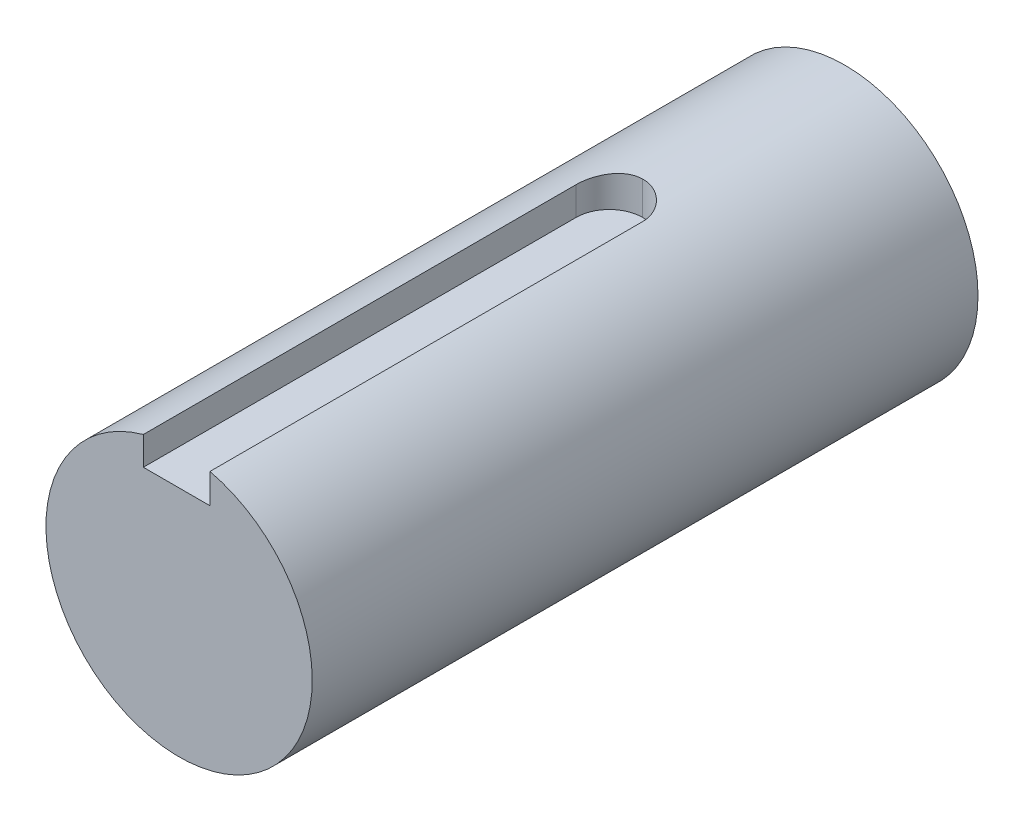
ISO-10303-21;
HEADER;
FILE_DESCRIPTION(('STEP AP214'),'2;1');
FILE_NAME('part.step','',(''),(''),'','','');
FILE_SCHEMA(('AUTOMOTIVE_DESIGN { 1 0 10303 214 1 1 1 1 }'));
ENDSEC;
DATA;
#1=APPLICATION_CONTEXT('core data for automotive mechanical design processes');
#2=APPLICATION_PROTOCOL_DEFINITION('international standard','automotive_design',2000,#1);
#3=PRODUCT_CONTEXT('',#1,'mechanical');
#4=PRODUCT('Part','Part','',(#3));
#5=PRODUCT_RELATED_PRODUCT_CATEGORY('part','',(#4));
#6=PRODUCT_DEFINITION_FORMATION('','',#4);
#7=PRODUCT_DEFINITION_CONTEXT('part definition',#1,'design');
#8=PRODUCT_DEFINITION('design','',#6,#7);
#9=PRODUCT_DEFINITION_SHAPE('','',#8);
#10=(LENGTH_UNIT() NAMED_UNIT(*) SI_UNIT(.MILLI.,.METRE.));
#11=(NAMED_UNIT(*) PLANE_ANGLE_UNIT() SI_UNIT($,.RADIAN.));
#12=(NAMED_UNIT(*) SI_UNIT($,.STERADIAN.) SOLID_ANGLE_UNIT());
#13=UNCERTAINTY_MEASURE_WITH_UNIT(LENGTH_MEASURE(1.E-05),#10,'distance_accuracy_value','');
#14=(GEOMETRIC_REPRESENTATION_CONTEXT(3) GLOBAL_UNCERTAINTY_ASSIGNED_CONTEXT((#13)) GLOBAL_UNIT_ASSIGNED_CONTEXT((#10,
#11,#12)) REPRESENTATION_CONTEXT('',''));
#15=CARTESIAN_POINT('',(0.,0.,0.));
#16=DIRECTION('',(0.,0.,1.));
#17=DIRECTION('',(1.,0.,0.));
#18=AXIS2_PLACEMENT_3D('',#15,#16,#17);
#19=CARTESIAN_POINT('',(0.,0.,250.));
#20=DIRECTION('',(0.,0.,-1.));
#21=DIRECTION('',(-1.,0.,0.));
#22=AXIS2_PLACEMENT_3D('',#19,#20,#21);
#23=CYLINDRICAL_SURFACE('',#22,50.);
#24=DIRECTION('',(0.,0.,-1.));
#25=VECTOR('',#24,1.);
#26=CARTESIAN_POINT('',(-13.4196866947124,48.1654648998197,250.));
#27=LINE('',#26,#25);
#28=CARTESIAN_POINT('',(-13.4196866947124,48.1654648998197,250.));
#29=VERTEX_POINT('',#28);
#30=CARTESIAN_POINT('',(-13.4196866947124,48.1654648998197,87.5));
#31=VERTEX_POINT('',#30);
#32=EDGE_CURVE('E107',#29,#31,#27,.T.);
#33=ORIENTED_EDGE('',*,*,#32,.T.);
#34=CARTESIAN_POINT('',(-13.4196866947124,48.1654648998197,87.5));
#35=CARTESIAN_POINT('',(-13.4197314172939,48.1654238247212,87.1553714433848));
#36=CARTESIAN_POINT('',(-13.4054364395308,48.169434414916,86.8107578187744));
#37=CARTESIAN_POINT('',(-13.3484965497938,48.1852596551349,86.1241223159848));
#38=CARTESIAN_POINT('',(-13.3058568365249,48.1970728740772,85.782099974171));
#39=CARTESIAN_POINT('',(-13.1926818394814,48.2281699255807,85.1038305596354));
#40=CARTESIAN_POINT('',(-13.1222083749684,48.2474372006231,84.767572399841));
#41=CARTESIAN_POINT('',(-12.9539783127379,48.2928781495041,84.1024291381831));
#42=CARTESIAN_POINT('',(-12.856221256358,48.3190519394473,83.77354416037));
#43=CARTESIAN_POINT('',(-12.6342444551584,48.3775672249386,83.1254786162954));
#44=CARTESIAN_POINT('',(-12.5100302140538,48.4099074375797,82.8062960474611));
#45=CARTESIAN_POINT('',(-12.2360899582294,48.4798729133013,82.1796662141205));
#46=CARTESIAN_POINT('',(-12.0863628698923,48.5174983987819,81.8722194441402));
#47=CARTESIAN_POINT('',(-11.7624571857099,48.5970410994236,81.2709573109787));
#48=CARTESIAN_POINT('',(-11.5882714161526,48.6389595727349,80.9771459808212));
#49=CARTESIAN_POINT('',(-11.2166993885674,48.7259894931234,80.4050816235214));
#50=CARTESIAN_POINT('',(-11.019312815791,48.7711009835147,80.126828807526));
#51=CARTESIAN_POINT('',(-10.5980102600967,48.8644016009679,79.581579920073));
#52=CARTESIAN_POINT('',(-10.3736014118056,48.9126368908033,79.3149724697492));
#53=CARTESIAN_POINT('',(-9.90333550259891,49.0100153882868,78.8014185772653));
#54=CARTESIAN_POINT('',(-9.65747148717771,49.0591588862235,78.5544785601135));
#55=CARTESIAN_POINT('',(-9.14593928050292,49.1570910090983,78.0819314904983));
#56=CARTESIAN_POINT('',(-8.88026998967754,49.2058796141677,77.8563256240685));
#57=CARTESIAN_POINT('',(-8.33084516387476,49.3018739648251,77.4279558970886));
#58=CARTESIAN_POINT('',(-8.04708966478739,49.3490797135539,77.2251919912134));
#59=CARTESIAN_POINT('',(-7.45779653513535,49.4416006884447,76.8402957683477));
#60=CARTESIAN_POINT('',(-7.15194883386476,49.4868634048124,76.6586251750676));
#61=CARTESIAN_POINT('',(-6.52554325225612,49.5733516679642,76.3218619841977));
#62=CARTESIAN_POINT('',(-6.20499057319327,49.6145786263047,76.1667600795435));
#63=CARTESIAN_POINT('',(-5.55145592870138,49.6919466661873,75.8843475528647));
#64=CARTESIAN_POINT('',(-5.21847977161125,49.7280900876482,75.7570241296124));
#65=CARTESIAN_POINT('',(-4.54237531312152,49.7943983662484,75.5311617732287));
#66=CARTESIAN_POINT('',(-4.19924950782947,49.8245646795203,75.4326158266004));
#67=CARTESIAN_POINT('',(-3.61281969780385,49.8698840119469,75.2910774215627));
#68=CARTESIAN_POINT('',(-3.37149133310396,49.88679392954,75.240331014629));
#69=CARTESIAN_POINT('',(-2.88605338455696,49.9172297073314,75.1531706136619));
#70=CARTESIAN_POINT('',(-2.64194403550385,49.9307558510347,75.1167554187605));
#71=CARTESIAN_POINT('',(-2.15200465394314,49.9542683333129,75.0584488144138));
#72=CARTESIAN_POINT('',(-1.90617594941087,49.9642571497514,75.0365472289175));
#73=CARTESIAN_POINT('',(-1.41347357736994,49.9806272973395,75.0073155981109));
#74=CARTESIAN_POINT('',(-1.16659966692733,49.9870077375118,74.9999891505578));
#75=CARTESIAN_POINT('',(-0.919686694712394,49.9915410482971,75.));
#76=B_SPLINE_CURVE_WITH_KNOTS('',3,(#34,#35,#36,#37,#38,#39,#40,#41,#42,#43,#44,#45,#46,#47,#48,
#49,#50,#51,#52,#53,#54,#55,#56,#57,#58,#59,#60,#61,#62,#63,#64,#65,#66,#67,#68,#69,#70,#71,#72,
#73,#74,#75),.UNSPECIFIED.,.F.,.F.,(4,2,2,2,2,2,2,2,2,2,2,2,2,2,2,2,2,2,2,2,4),(0.,
1.03354315946745,2.06689680917196,3.0979681531027,4.12905683134308,5.15993122807173,
6.1908490161961,7.22206980574201,8.25330458673506,9.30750205093521,10.3620425024297,
11.4166415447634,12.4712384944302,13.5457433722516,14.6198710757082,15.6935027357117,
16.7668725169962,17.5080116533766,18.2490886736015,18.9896455448599,19.730385194037),.UNSPECIFIED.);
#77=CARTESIAN_POINT('',(-0.919686694712393,49.9915410482971,75.));
#78=VERTEX_POINT('',#77);
#79=EDGE_CURVE('E133',#31,#78,#76,.T.);
#80=ORIENTED_EDGE('',*,*,#79,.T.);
#81=CARTESIAN_POINT('',(-0.919686694712393,49.9915410482971,75.));
#82=CARTESIAN_POINT('',(-0.574763150116021,49.9979217075615,74.999956461965));
#83=CARTESIAN_POINT('',(-0.229782589298516,50.0006633534298,75.0142748097166));
#84=CARTESIAN_POINT('',(0.457755803628833,49.9990767886091,75.0713502612933));
#85=CARTESIAN_POINT('',(0.800313960251213,49.9947495436264,75.1141034800564));
#86=CARTESIAN_POINT('',(1.47992371627732,49.97924965398,75.2276564208399));
#87=CARTESIAN_POINT('',(1.81698449723875,49.9680899590219,75.2984029968736));
#88=CARTESIAN_POINT('',(2.48386622523912,49.9393806478631,75.4673722815579));
#89=CARTESIAN_POINT('',(2.81368713676324,49.9218310003241,75.5655951249595));
#90=CARTESIAN_POINT('',(3.46379665339108,49.8809404905811,75.7887577169107));
#91=CARTESIAN_POINT('',(3.78408503421497,49.8575994922395,75.9136980935009));
#92=CARTESIAN_POINT('',(4.4129592170745,49.8058765937741,76.1893518707077));
#93=CARTESIAN_POINT('',(4.72154453638634,49.7774944859902,76.3400663330354));
#94=CARTESIAN_POINT('',(5.32500978396252,49.7165593378245,76.6661908640142));
#95=CARTESIAN_POINT('',(5.61988734963144,49.6840055820452,76.8416051689617));
#96=CARTESIAN_POINT('',(6.19397646907551,49.6157055035064,77.2158755523418));
#97=CARTESIAN_POINT('',(6.47318788243429,49.5799591521389,77.4147318408364));
#98=CARTESIAN_POINT('',(7.018634425395,49.5057146430575,77.8380032773716));
#99=CARTESIAN_POINT('',(7.28457963711069,49.4671808270901,78.062785831492));
#100=CARTESIAN_POINT('',(7.79671886619152,49.3890503142146,78.5336584604721));
#101=CARTESIAN_POINT('',(8.04291262597645,49.3494536034543,78.7797488131213));
#102=CARTESIAN_POINT('',(8.5139905796097,49.2703666977943,79.291665674633));
#103=CARTESIAN_POINT('',(8.73886992243569,49.2308765291203,79.5574966518975));
#104=CARTESIAN_POINT('',(9.16575656322504,49.1531890018889,80.1071041380193));
#105=CARTESIAN_POINT('',(9.36776401289365,49.1149916347578,80.3908805278284));
#106=CARTESIAN_POINT('',(9.75064621446883,49.0404279864625,80.9793234937858));
#107=CARTESIAN_POINT('',(9.9311195471943,49.0041020654509,81.2842565575896));
#108=CARTESIAN_POINT('',(10.2656785186331,48.9351104487954,81.9086630414335));
#109=CARTESIAN_POINT('',(10.4197647910776,48.9024446652535,82.2281361120369));
#110=CARTESIAN_POINT('',(10.7002880581889,48.8418307049072,82.8792026271399));
#111=CARTESIAN_POINT('',(10.8267413452019,48.8138797504796,83.2107887944363));
#112=CARTESIAN_POINT('',(11.0510796102244,48.7635815315076,83.8838527422062));
#113=CARTESIAN_POINT('',(11.148971376211,48.7412329356758,84.2253281511449));
#114=CARTESIAN_POINT('',(11.28990142644,48.708742475868,84.809896202701));
#115=CARTESIAN_POINT('',(11.3405573997959,48.6969583578021,85.0510916332184));
#116=CARTESIAN_POINT('',(11.4275447544873,48.6766187783717,85.5361827500894));
#117=CARTESIAN_POINT('',(11.4638772830175,48.6680630584404,85.7800782185821));
#118=CARTESIAN_POINT('',(11.5220384559871,48.6543273641371,86.2694947367412));
#119=CARTESIAN_POINT('',(11.5438781532041,48.6491448173144,86.5150144030684));
#120=CARTESIAN_POINT('',(11.5730226410195,48.6422160406467,87.0070211497196));
#121=CARTESIAN_POINT('',(11.5803239920142,48.6404706239877,87.2535084451558));
#122=CARTESIAN_POINT('',(11.5803133052876,48.6404805049393,87.5));
#123=B_SPLINE_CURVE_WITH_KNOTS('',3,(#81,#82,#83,#84,#85,#86,#87,#88,#89,#90,#91,#92,#93,#94,
#95,#96,#97,#98,#99,#100,#101,#102,#103,#104,#105,#106,#107,#108,#109,#110,#111,#112,#113,#114,
#115,#116,#117,#118,#119,#120,#121,#122),.UNSPECIFIED.,.F.,.F.,(4,2,2,2,2,2,2,2,2,2,2,2,2,2,2,2,
2,2,2,2,4),(0.,1.03461659159279,2.06909185234648,3.10161249113423,4.13413819376962,
5.1666881703275,6.19928069092708,7.23205052877586,8.26482962190399,9.31463997649933,
10.3644640195275,11.4145264247952,12.4645818647751,13.5318775421221,14.5991475829087,
15.6657866556291,16.7321720223168,17.4719742152231,18.2117171437831,18.9508952662473,
19.6902482488919),.UNSPECIFIED.);
#124=CARTESIAN_POINT('',(11.5803133052876,48.6404805049393,87.5));
#125=VERTEX_POINT('',#124);
#126=EDGE_CURVE('E11',#78,#125,#123,.T.);
#127=ORIENTED_EDGE('',*,*,#126,.T.);
#128=DIRECTION('',(0.,0.,-1.));
#129=VECTOR('',#128,1.);
#130=CARTESIAN_POINT('',(11.5803133052876,48.6404805049393,250.));
#131=LINE('',#130,#129);
#132=CARTESIAN_POINT('',(11.5803133052876,48.6404805049393,250.));
#133=VERTEX_POINT('',#132);
#134=EDGE_CURVE('E122',#125,#133,#131,.F.);
#135=ORIENTED_EDGE('',*,*,#134,.T.);
#136=CARTESIAN_POINT('',(0.,0.,250.));
#137=DIRECTION('',(0.,0.,1.));
#138=DIRECTION('',(1.,0.,0.));
#139=AXIS2_PLACEMENT_3D('',#136,#137,#138);
#140=CIRCLE('',#139,50.);
#141=EDGE_CURVE('E112',#29,#133,#140,.T.);
#142=ORIENTED_EDGE('',*,*,#141,.F.);
#143=EDGE_LOOP('',(#33,#80,#127,#135,#142));
#144=FACE_BOUND('',#143,.T.);
#145=CARTESIAN_POINT('',(0.,0.,0.));
#146=DIRECTION('',(0.,0.,1.));
#147=DIRECTION('',(1.,0.,0.));
#148=AXIS2_PLACEMENT_3D('',#145,#146,#147);
#149=CIRCLE('',#148,50.);
#150=CARTESIAN_POINT('',(50.,0.,0.));
#151=VERTEX_POINT('',#150);
#152=EDGE_CURVE('E124',#151,#151,#149,.T.);
#153=ORIENTED_EDGE('',*,*,#152,.T.);
#154=EDGE_LOOP('',(#153));
#155=FACE_BOUND('',#154,.T.);
#156=ADVANCED_FACE('F40',(#144,#155),#23,.T.);
#157=CARTESIAN_POINT('',(0.,0.,250.));
#158=DIRECTION('',(0.,0.,1.));
#159=DIRECTION('',(1.,0.,0.));
#160=AXIS2_PLACEMENT_3D('',#157,#158,#159);
#161=PLANE('',#160);
#162=DIRECTION('',(0.,1.,0.));
#163=VECTOR('',#162,1.);
#164=CARTESIAN_POINT('',(11.5803133052876,37.4915410482971,250.));
#165=LINE('',#164,#163);
#166=CARTESIAN_POINT('',(11.5803133052876,37.4915410482971,250.));
#167=VERTEX_POINT('',#166);
#168=EDGE_CURVE('E116',#167,#133,#165,.T.);
#169=ORIENTED_EDGE('',*,*,#168,.F.);
#170=DIRECTION('',(1.,0.,0.));
#171=VECTOR('',#170,1.);
#172=CARTESIAN_POINT('',(-13.4196866947124,37.491541048297,250.));
#173=LINE('',#172,#171);
#174=CARTESIAN_POINT('',(-13.4196866947124,37.491541048297,250.));
#175=VERTEX_POINT('',#174);
#176=EDGE_CURVE('E95',#175,#167,#173,.T.);
#177=ORIENTED_EDGE('',*,*,#176,.F.);
#178=DIRECTION('',(0.,-1.,0.));
#179=VECTOR('',#178,1.);
#180=CARTESIAN_POINT('',(-13.4196866947124,0.,250.));
#181=LINE('',#180,#179);
#182=EDGE_CURVE('E104',#29,#175,#181,.T.);
#183=ORIENTED_EDGE('',*,*,#182,.F.);
#184=ORIENTED_EDGE('',*,*,#141,.T.);
#185=EDGE_LOOP('',(#169,#177,#183,#184));
#186=FACE_BOUND('',#185,.T.);
#187=ADVANCED_FACE('F114',(#186),#161,.T.);
#188=CARTESIAN_POINT('',(0.,0.,0.));
#189=DIRECTION('',(0.,0.,1.));
#190=DIRECTION('',(1.,0.,0.));
#191=AXIS2_PLACEMENT_3D('',#188,#189,#190);
#192=PLANE('',#191);
#193=ORIENTED_EDGE('',*,*,#152,.F.);
#194=EDGE_LOOP('',(#193));
#195=FACE_BOUND('',#194,.T.);
#196=ADVANCED_FACE('F156',(#195),#192,.F.);
#197=CARTESIAN_POINT('',(11.5803133052876,37.4915410482971,75.));
#198=DIRECTION('',(1.,0.,0.));
#199=DIRECTION('',(0.,0.,-1.));
#200=AXIS2_PLACEMENT_3D('',#197,#198,#199);
#201=PLANE('',#200);
#202=ORIENTED_EDGE('',*,*,#134,.F.);
#203=DIRECTION('',(0.,1.,0.));
#204=VECTOR('',#203,1.);
#205=CARTESIAN_POINT('',(11.5803133052876,37.4915410482971,87.5));
#206=LINE('',#205,#204);
#207=CARTESIAN_POINT('',(11.5803133052876,37.4915410482971,87.5));
#208=VERTEX_POINT('',#207);
#209=EDGE_CURVE('E66',#125,#208,#206,.F.);
#210=ORIENTED_EDGE('',*,*,#209,.T.);
#211=DIRECTION('',(0.,0.,1.));
#212=VECTOR('',#211,1.);
#213=CARTESIAN_POINT('',(11.5803133052876,37.4915410482971,75.));
#214=LINE('',#213,#212);
#215=EDGE_CURVE('E101',#208,#167,#214,.T.);
#216=ORIENTED_EDGE('',*,*,#215,.T.);
#217=ORIENTED_EDGE('',*,*,#168,.T.);
#218=EDGE_LOOP('',(#202,#210,#216,#217));
#219=FACE_BOUND('',#218,.T.);
#220=ADVANCED_FACE('F162',(#219),#201,.F.);
#221=CARTESIAN_POINT('',(-13.4196866947124,37.491541048297,75.));
#222=DIRECTION('',(-1.,0.,0.));
#223=DIRECTION('',(0.,0.,1.));
#224=AXIS2_PLACEMENT_3D('',#221,#222,#223);
#225=PLANE('',#224);
#226=DIRECTION('',(0.,0.,1.));
#227=VECTOR('',#226,1.);
#228=CARTESIAN_POINT('',(-13.4196866947124,37.491541048297,75.));
#229=LINE('',#228,#227);
#230=CARTESIAN_POINT('',(-13.4196866947124,37.491541048297,87.5));
#231=VERTEX_POINT('',#230);
#232=EDGE_CURVE('E91',#231,#175,#229,.T.);
#233=ORIENTED_EDGE('',*,*,#232,.F.);
#234=DIRECTION('',(0.,-1.,0.));
#235=VECTOR('',#234,1.);
#236=CARTESIAN_POINT('',(-13.4196866947124,48.1654648998197,87.5));
#237=LINE('',#236,#235);
#238=EDGE_CURVE('E131',#231,#31,#237,.F.);
#239=ORIENTED_EDGE('',*,*,#238,.T.);
#240=ORIENTED_EDGE('',*,*,#32,.F.);
#241=ORIENTED_EDGE('',*,*,#182,.T.);
#242=EDGE_LOOP('',(#233,#239,#240,#241));
#243=FACE_BOUND('',#242,.T.);
#244=ADVANCED_FACE('F105',(#243),#225,.F.);
#245=CARTESIAN_POINT('',(-13.4196866947124,37.491541048297,75.));
#246=DIRECTION('',(0.,-1.,0.));
#247=DIRECTION('',(1.,0.,0.));
#248=AXIS2_PLACEMENT_3D('',#245,#246,#247);
#249=PLANE('',#248);
#250=ORIENTED_EDGE('',*,*,#215,.F.);
#251=CARTESIAN_POINT('',(-0.919686694712393,37.4915410482971,87.5));
#252=DIRECTION('',(0.,-1.,0.));
#253=DIRECTION('',(1.,0.,0.));
#254=AXIS2_PLACEMENT_3D('',#251,#252,#253);
#255=CIRCLE('',#254,12.5);
#256=CARTESIAN_POINT('',(-0.919686694712393,37.4915410482971,75.));
#257=VERTEX_POINT('',#256);
#258=EDGE_CURVE('E54',#208,#257,#255,.F.);
#259=ORIENTED_EDGE('',*,*,#258,.T.);
#260=CARTESIAN_POINT('',(-0.919686694712393,37.4915410482971,87.5));
#261=DIRECTION('',(0.,-1.,0.));
#262=DIRECTION('',(1.,0.,0.));
#263=AXIS2_PLACEMENT_3D('',#260,#261,#262);
#264=CIRCLE('',#263,12.5);
#265=EDGE_CURVE('E98',#257,#231,#264,.F.);
#266=ORIENTED_EDGE('',*,*,#265,.T.);
#267=ORIENTED_EDGE('',*,*,#232,.T.);
#268=ORIENTED_EDGE('',*,*,#176,.T.);
#269=EDGE_LOOP('',(#250,#259,#266,#267,#268));
#270=FACE_BOUND('',#269,.T.);
#271=ADVANCED_FACE('F93',(#270),#249,.F.);
#272=CARTESIAN_POINT('',(-0.919686694712393,0.,87.5));
#273=DIRECTION('',(0.,1.,0.));
#274=DIRECTION('',(0.,0.,1.));
#275=AXIS2_PLACEMENT_3D('',#272,#273,#274);
#276=CYLINDRICAL_SURFACE('',#275,12.5);
#277=ORIENTED_EDGE('',*,*,#79,.F.);
#278=ORIENTED_EDGE('',*,*,#238,.F.);
#279=ORIENTED_EDGE('',*,*,#265,.F.);
#280=DIRECTION('',(0.,-1.,0.));
#281=VECTOR('',#280,1.);
#282=CARTESIAN_POINT('',(-0.919686694712393,37.491541048297,75.));
#283=LINE('',#282,#281);
#284=EDGE_CURVE('E111',#78,#257,#283,.T.);
#285=ORIENTED_EDGE('',*,*,#284,.F.);
#286=EDGE_LOOP('',(#277,#278,#279,#285));
#287=FACE_BOUND('',#286,.T.);
#288=ADVANCED_FACE('F141',(#287),#276,.F.);
#289=CARTESIAN_POINT('',(-0.919686694712393,0.,87.5));
#290=DIRECTION('',(0.,-1.,0.));
#291=DIRECTION('',(0.,0.,-1.));
#292=AXIS2_PLACEMENT_3D('',#289,#290,#291);
#293=CYLINDRICAL_SURFACE('',#292,12.5);
#294=ORIENTED_EDGE('',*,*,#258,.F.);
#295=ORIENTED_EDGE('',*,*,#209,.F.);
#296=ORIENTED_EDGE('',*,*,#126,.F.);
#297=ORIENTED_EDGE('',*,*,#284,.T.);
#298=EDGE_LOOP('',(#294,#295,#296,#297));
#299=FACE_BOUND('',#298,.T.);
#300=ADVANCED_FACE('F42',(#299),#293,.F.);
#301=CLOSED_SHELL('',(#156,#187,#196,#220,#244,#271,#288,#300));
#302=MANIFOLD_SOLID_BREP('B2',#301);
#303=ADVANCED_BREP_SHAPE_REPRESENTATION('',(#18,#302),#14);
#304=SHAPE_DEFINITION_REPRESENTATION(#9,#303);
ENDSEC;
END-ISO-10303-21;
